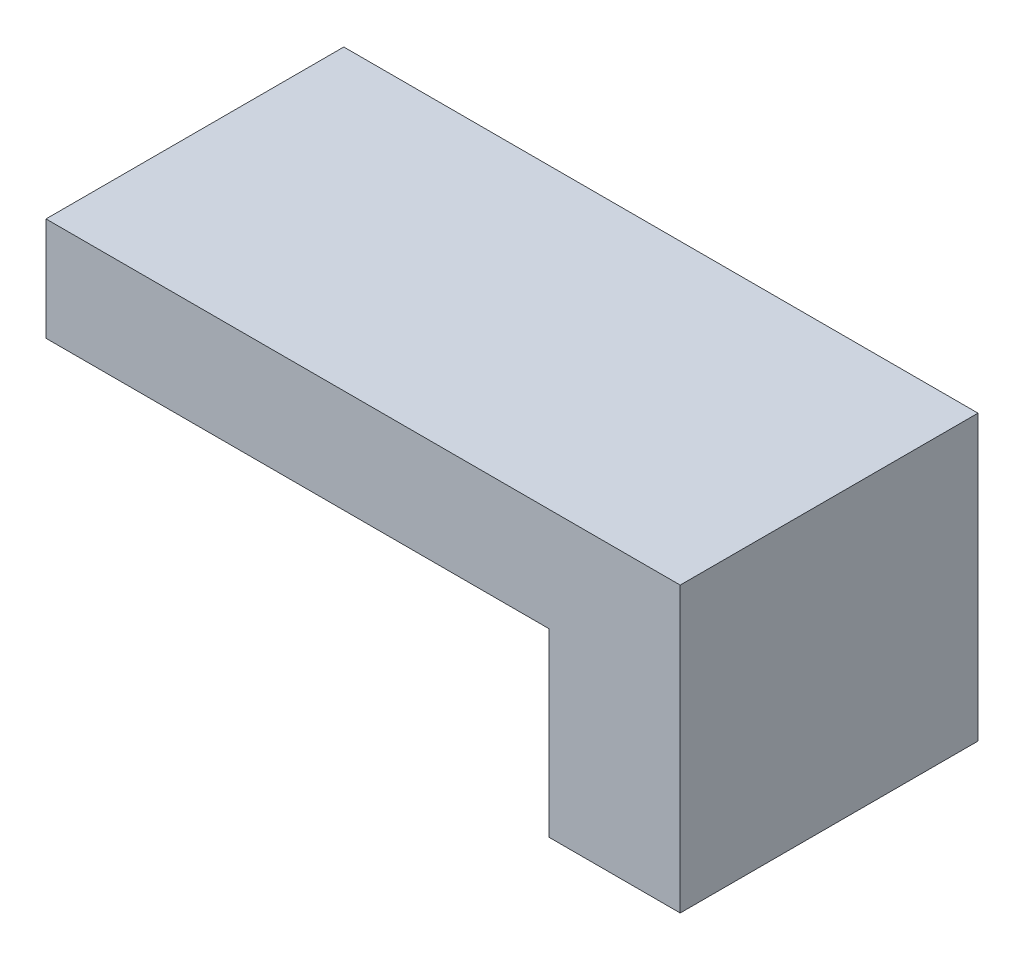
ISO-10303-21;
HEADER;
FILE_DESCRIPTION(('STEP AP214'),'2;1');
FILE_NAME('part.step','',(''),(''),'','','');
FILE_SCHEMA(('AUTOMOTIVE_DESIGN { 1 0 10303 214 1 1 1 1 }'));
ENDSEC;
DATA;
#1=APPLICATION_CONTEXT('core data for automotive mechanical design processes');
#2=APPLICATION_PROTOCOL_DEFINITION('international standard','automotive_design',2000,#1);
#3=PRODUCT_CONTEXT('',#1,'mechanical');
#4=PRODUCT('Part','Part','',(#3));
#5=PRODUCT_RELATED_PRODUCT_CATEGORY('part','',(#4));
#6=PRODUCT_DEFINITION_FORMATION('','',#4);
#7=PRODUCT_DEFINITION_CONTEXT('part definition',#1,'design');
#8=PRODUCT_DEFINITION('design','',#6,#7);
#9=PRODUCT_DEFINITION_SHAPE('','',#8);
#10=(LENGTH_UNIT() NAMED_UNIT(*) SI_UNIT(.MILLI.,.METRE.));
#11=(NAMED_UNIT(*) PLANE_ANGLE_UNIT() SI_UNIT($,.RADIAN.));
#12=(NAMED_UNIT(*) SI_UNIT($,.STERADIAN.) SOLID_ANGLE_UNIT());
#13=UNCERTAINTY_MEASURE_WITH_UNIT(LENGTH_MEASURE(1.E-05),#10,'distance_accuracy_value','');
#14=(GEOMETRIC_REPRESENTATION_CONTEXT(3) GLOBAL_UNCERTAINTY_ASSIGNED_CONTEXT((#13)) GLOBAL_UNIT_ASSIGNED_CONTEXT((#10,
#11,#12)) REPRESENTATION_CONTEXT('',''));
#15=CARTESIAN_POINT('',(0.,0.,0.));
#16=DIRECTION('',(0.,0.,1.));
#17=DIRECTION('',(1.,0.,0.));
#18=AXIS2_PLACEMENT_3D('',#15,#16,#17);
#19=CARTESIAN_POINT('',(-4.75,0.,10.8));
#20=DIRECTION('',(1.,0.,0.));
#21=DIRECTION('',(0.,0.,-1.));
#22=AXIS2_PLACEMENT_3D('',#19,#20,#21);
#23=PLANE('',#22);
#24=DIRECTION('',(0.,-1.,0.));
#25=VECTOR('',#24,1.);
#26=CARTESIAN_POINT('',(-4.75,0.,0.));
#27=LINE('',#26,#25);
#28=CARTESIAN_POINT('',(-4.75,6.55,0.));
#29=VERTEX_POINT('',#28);
#30=CARTESIAN_POINT('',(-4.75,0.,0.));
#31=VERTEX_POINT('',#30);
#32=EDGE_CURVE('E117',#29,#31,#27,.T.);
#33=ORIENTED_EDGE('',*,*,#32,.T.);
#34=DIRECTION('',(0.,0.,-1.));
#35=VECTOR('',#34,1.);
#36=CARTESIAN_POINT('',(-4.75,0.,10.8));
#37=LINE('',#36,#35);
#38=CARTESIAN_POINT('',(-4.75,0.,10.8));
#39=VERTEX_POINT('',#38);
#40=EDGE_CURVE('E11',#39,#31,#37,.T.);
#41=ORIENTED_EDGE('',*,*,#40,.F.);
#42=DIRECTION('',(0.,-1.,0.));
#43=VECTOR('',#42,1.);
#44=CARTESIAN_POINT('',(-4.75,0.,10.8));
#45=LINE('',#44,#43);
#46=CARTESIAN_POINT('',(-4.75,6.55,10.8));
#47=VERTEX_POINT('',#46);
#48=EDGE_CURVE('E127',#47,#39,#45,.T.);
#49=ORIENTED_EDGE('',*,*,#48,.F.);
#50=DIRECTION('',(0.,0.,-1.));
#51=VECTOR('',#50,1.);
#52=CARTESIAN_POINT('',(-4.75,6.55,10.8));
#53=LINE('',#52,#51);
#54=EDGE_CURVE('E113',#47,#29,#53,.T.);
#55=ORIENTED_EDGE('',*,*,#54,.T.);
#56=EDGE_LOOP('',(#33,#41,#49,#55));
#57=FACE_BOUND('',#56,.T.);
#58=ADVANCED_FACE('F33',(#57),#23,.F.);
#59=CARTESIAN_POINT('',(0.,0.,10.8));
#60=DIRECTION('',(0.,1.,0.));
#61=DIRECTION('',(-1.,0.,0.));
#62=AXIS2_PLACEMENT_3D('',#59,#60,#61);
#63=PLANE('',#62);
#64=DIRECTION('',(1.,0.,0.));
#65=VECTOR('',#64,1.);
#66=CARTESIAN_POINT('',(0.,0.,0.));
#67=LINE('',#66,#65);
#68=CARTESIAN_POINT('',(0.,0.,0.));
#69=VERTEX_POINT('',#68);
#70=EDGE_CURVE('E120',#31,#69,#67,.T.);
#71=ORIENTED_EDGE('',*,*,#70,.T.);
#72=DIRECTION('',(0.,0.,-1.));
#73=VECTOR('',#72,1.);
#74=CARTESIAN_POINT('',(0.,0.,10.8));
#75=LINE('',#74,#73);
#76=CARTESIAN_POINT('',(0.,0.,10.8));
#77=VERTEX_POINT('',#76);
#78=EDGE_CURVE('E41',#77,#69,#75,.T.);
#79=ORIENTED_EDGE('',*,*,#78,.F.);
#80=DIRECTION('',(1.,0.,0.));
#81=VECTOR('',#80,1.);
#82=CARTESIAN_POINT('',(0.,0.,10.8));
#83=LINE('',#82,#81);
#84=EDGE_CURVE('E86',#39,#77,#83,.T.);
#85=ORIENTED_EDGE('',*,*,#84,.F.);
#86=ORIENTED_EDGE('',*,*,#40,.T.);
#87=EDGE_LOOP('',(#71,#79,#85,#86));
#88=FACE_BOUND('',#87,.T.);
#89=ADVANCED_FACE('F151',(#88),#63,.F.);
#90=CARTESIAN_POINT('',(0.,10.3,10.8));
#91=DIRECTION('',(-1.,0.,0.));
#92=DIRECTION('',(0.,-1.,0.));
#93=AXIS2_PLACEMENT_3D('',#90,#91,#92);
#94=PLANE('',#93);
#95=DIRECTION('',(0.,1.,0.));
#96=VECTOR('',#95,1.);
#97=CARTESIAN_POINT('',(0.,10.3,0.));
#98=LINE('',#97,#96);
#99=CARTESIAN_POINT('',(0.,10.3,0.));
#100=VERTEX_POINT('',#99);
#101=EDGE_CURVE('E122',#69,#100,#98,.T.);
#102=ORIENTED_EDGE('',*,*,#101,.T.);
#103=DIRECTION('',(0.,0.,-1.));
#104=VECTOR('',#103,1.);
#105=CARTESIAN_POINT('',(0.,10.3,10.8));
#106=LINE('',#105,#104);
#107=CARTESIAN_POINT('',(0.,10.3,10.8));
#108=VERTEX_POINT('',#107);
#109=EDGE_CURVE('E108',#108,#100,#106,.T.);
#110=ORIENTED_EDGE('',*,*,#109,.F.);
#111=DIRECTION('',(0.,1.,0.));
#112=VECTOR('',#111,1.);
#113=CARTESIAN_POINT('',(0.,10.3,10.8));
#114=LINE('',#113,#112);
#115=EDGE_CURVE('E99',#77,#108,#114,.T.);
#116=ORIENTED_EDGE('',*,*,#115,.F.);
#117=ORIENTED_EDGE('',*,*,#78,.T.);
#118=EDGE_LOOP('',(#102,#110,#116,#117));
#119=FACE_BOUND('',#118,.T.);
#120=ADVANCED_FACE('F133',(#119),#94,.F.);
#121=CARTESIAN_POINT('',(-23.,10.3,10.8));
#122=DIRECTION('',(0.,-1.,0.));
#123=DIRECTION('',(0.,0.,-1.));
#124=AXIS2_PLACEMENT_3D('',#121,#122,#123);
#125=PLANE('',#124);
#126=DIRECTION('',(-1.,0.,0.));
#127=VECTOR('',#126,1.);
#128=CARTESIAN_POINT('',(-23.,10.3,0.));
#129=LINE('',#128,#127);
#130=CARTESIAN_POINT('',(-23.,10.3,0.));
#131=VERTEX_POINT('',#130);
#132=EDGE_CURVE('E107',#100,#131,#129,.T.);
#133=ORIENTED_EDGE('',*,*,#132,.T.);
#134=DIRECTION('',(0.,0.,-1.));
#135=VECTOR('',#134,1.);
#136=CARTESIAN_POINT('',(-23.,10.3,10.8));
#137=LINE('',#136,#135);
#138=CARTESIAN_POINT('',(-23.,10.3,10.8));
#139=VERTEX_POINT('',#138);
#140=EDGE_CURVE('E104',#139,#131,#137,.T.);
#141=ORIENTED_EDGE('',*,*,#140,.F.);
#142=DIRECTION('',(-1.,0.,0.));
#143=VECTOR('',#142,1.);
#144=CARTESIAN_POINT('',(-23.,10.3,10.8));
#145=LINE('',#144,#143);
#146=EDGE_CURVE('E93',#108,#139,#145,.T.);
#147=ORIENTED_EDGE('',*,*,#146,.F.);
#148=ORIENTED_EDGE('',*,*,#109,.T.);
#149=EDGE_LOOP('',(#133,#141,#147,#148));
#150=FACE_BOUND('',#149,.T.);
#151=ADVANCED_FACE('F105',(#150),#125,.F.);
#152=CARTESIAN_POINT('',(-23.,6.54999999999999,10.8));
#153=DIRECTION('',(1.,0.,0.));
#154=DIRECTION('',(0.,0.,-1.));
#155=AXIS2_PLACEMENT_3D('',#152,#153,#154);
#156=PLANE('',#155);
#157=DIRECTION('',(0.,-1.,0.));
#158=VECTOR('',#157,1.);
#159=CARTESIAN_POINT('',(-23.,6.54999999999999,0.));
#160=LINE('',#159,#158);
#161=CARTESIAN_POINT('',(-23.,6.54999999999999,0.));
#162=VERTEX_POINT('',#161);
#163=EDGE_CURVE('E72',#131,#162,#160,.T.);
#164=ORIENTED_EDGE('',*,*,#163,.T.);
#165=DIRECTION('',(0.,0.,-1.));
#166=VECTOR('',#165,1.);
#167=CARTESIAN_POINT('',(-23.,6.54999999999999,10.8));
#168=LINE('',#167,#166);
#169=CARTESIAN_POINT('',(-23.,6.54999999999999,10.8));
#170=VERTEX_POINT('',#169);
#171=EDGE_CURVE('E109',#170,#162,#168,.T.);
#172=ORIENTED_EDGE('',*,*,#171,.F.);
#173=DIRECTION('',(0.,-1.,0.));
#174=VECTOR('',#173,1.);
#175=CARTESIAN_POINT('',(-23.,6.54999999999999,10.8));
#176=LINE('',#175,#174);
#177=EDGE_CURVE('E97',#139,#170,#176,.T.);
#178=ORIENTED_EDGE('',*,*,#177,.F.);
#179=ORIENTED_EDGE('',*,*,#140,.T.);
#180=EDGE_LOOP('',(#164,#172,#178,#179));
#181=FACE_BOUND('',#180,.T.);
#182=ADVANCED_FACE('F111',(#181),#156,.F.);
#183=CARTESIAN_POINT('',(-23.,6.54999999999999,10.8));
#184=DIRECTION('',(0.,1.,0.));
#185=DIRECTION('',(-1.,0.,0.));
#186=AXIS2_PLACEMENT_3D('',#183,#184,#185);
#187=PLANE('',#186);
#188=DIRECTION('',(1.,0.,0.));
#189=VECTOR('',#188,1.);
#190=CARTESIAN_POINT('',(-23.,6.54999999999999,0.));
#191=LINE('',#190,#189);
#192=EDGE_CURVE('E78',#162,#29,#191,.T.);
#193=ORIENTED_EDGE('',*,*,#192,.T.);
#194=ORIENTED_EDGE('',*,*,#54,.F.);
#195=DIRECTION('',(1.,0.,0.));
#196=VECTOR('',#195,1.);
#197=CARTESIAN_POINT('',(-23.,6.54999999999999,10.8));
#198=LINE('',#197,#196);
#199=EDGE_CURVE('E49',#170,#47,#198,.T.);
#200=ORIENTED_EDGE('',*,*,#199,.F.);
#201=ORIENTED_EDGE('',*,*,#171,.T.);
#202=EDGE_LOOP('',(#193,#194,#200,#201));
#203=FACE_BOUND('',#202,.T.);
#204=ADVANCED_FACE('F140',(#203),#187,.F.);
#205=CARTESIAN_POINT('',(0.,0.,10.8));
#206=DIRECTION('',(0.,0.,-1.));
#207=DIRECTION('',(-1.,0.,0.));
#208=AXIS2_PLACEMENT_3D('',#205,#206,#207);
#209=PLANE('',#208);
#210=ORIENTED_EDGE('',*,*,#48,.T.);
#211=ORIENTED_EDGE('',*,*,#84,.T.);
#212=ORIENTED_EDGE('',*,*,#115,.T.);
#213=ORIENTED_EDGE('',*,*,#146,.T.);
#214=ORIENTED_EDGE('',*,*,#177,.T.);
#215=ORIENTED_EDGE('',*,*,#199,.T.);
#216=EDGE_LOOP('',(#210,#211,#212,#213,#214,#215));
#217=FACE_BOUND('',#216,.T.);
#218=ADVANCED_FACE('F95',(#217),#209,.F.);
#219=CARTESIAN_POINT('',(0.,0.,0.));
#220=DIRECTION('',(0.,0.,-1.));
#221=DIRECTION('',(-1.,0.,0.));
#222=AXIS2_PLACEMENT_3D('',#219,#220,#221);
#223=PLANE('',#222);
#224=ORIENTED_EDGE('',*,*,#32,.F.);
#225=ORIENTED_EDGE('',*,*,#192,.F.);
#226=ORIENTED_EDGE('',*,*,#163,.F.);
#227=ORIENTED_EDGE('',*,*,#132,.F.);
#228=ORIENTED_EDGE('',*,*,#101,.F.);
#229=ORIENTED_EDGE('',*,*,#70,.F.);
#230=EDGE_LOOP('',(#224,#225,#226,#227,#228,#229));
#231=FACE_BOUND('',#230,.T.);
#232=ADVANCED_FACE('F136',(#231),#223,.T.);
#233=CLOSED_SHELL('',(#58,#89,#120,#151,#182,#204,#218,#232));
#234=MANIFOLD_SOLID_BREP('B2',#233);
#235=ADVANCED_BREP_SHAPE_REPRESENTATION('',(#18,#234),#14);
#236=SHAPE_DEFINITION_REPRESENTATION(#9,#235);
ENDSEC;
END-ISO-10303-21;
